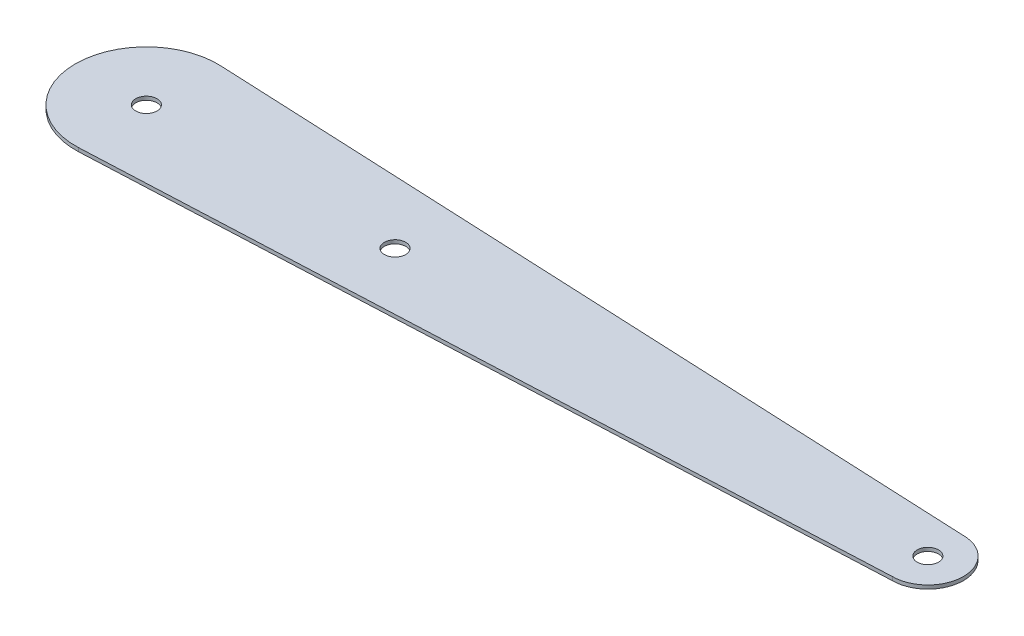
ISO-10303-21;
HEADER;
FILE_DESCRIPTION(('STEP AP214'),'2;1');
FILE_NAME('part.step','',(''),(''),'','','');
FILE_SCHEMA(('AUTOMOTIVE_DESIGN { 1 0 10303 214 1 1 1 1 }'));
ENDSEC;
DATA;
#1=APPLICATION_CONTEXT('core data for automotive mechanical design processes');
#2=APPLICATION_PROTOCOL_DEFINITION('international standard','automotive_design',2000,#1);
#3=PRODUCT_CONTEXT('',#1,'mechanical');
#4=PRODUCT('Part','Part','',(#3));
#5=PRODUCT_RELATED_PRODUCT_CATEGORY('part','',(#4));
#6=PRODUCT_DEFINITION_FORMATION('','',#4);
#7=PRODUCT_DEFINITION_CONTEXT('part definition',#1,'design');
#8=PRODUCT_DEFINITION('design','',#6,#7);
#9=PRODUCT_DEFINITION_SHAPE('','',#8);
#10=(LENGTH_UNIT() NAMED_UNIT(*) SI_UNIT(.MILLI.,.METRE.));
#11=(NAMED_UNIT(*) PLANE_ANGLE_UNIT() SI_UNIT($,.RADIAN.));
#12=(NAMED_UNIT(*) SI_UNIT($,.STERADIAN.) SOLID_ANGLE_UNIT());
#13=UNCERTAINTY_MEASURE_WITH_UNIT(LENGTH_MEASURE(1.E-05),#10,'distance_accuracy_value','');
#14=(GEOMETRIC_REPRESENTATION_CONTEXT(3) GLOBAL_UNCERTAINTY_ASSIGNED_CONTEXT((#13)) GLOBAL_UNIT_ASSIGNED_CONTEXT((#10,
#11,#12)) REPRESENTATION_CONTEXT('',''));
#15=CARTESIAN_POINT('',(0.,0.,0.));
#16=DIRECTION('',(0.,0.,1.));
#17=DIRECTION('',(1.,0.,0.));
#18=AXIS2_PLACEMENT_3D('',#15,#16,#17);
#19=CARTESIAN_POINT('',(300.,2.54,0.));
#20=DIRECTION('',(0.,-1.,0.));
#21=DIRECTION('',(0.,0.,-1.));
#22=AXIS2_PLACEMENT_3D('',#19,#20,#21);
#23=CYLINDRICAL_SURFACE('',#22,25.);
#24=CARTESIAN_POINT('',(300.,0.,0.));
#25=DIRECTION('',(0.,1.,0.));
#26=DIRECTION('',(0.,0.,1.));
#27=AXIS2_PLACEMENT_3D('',#24,#25,#26);
#28=CIRCLE('',#27,25.);
#29=CARTESIAN_POINT('',(300.,0.,25.));
#30=VERTEX_POINT('',#29);
#31=CARTESIAN_POINT('',(300.,0.,-25.));
#32=VERTEX_POINT('',#31);
#33=EDGE_CURVE('E116',#30,#32,#28,.T.);
#34=ORIENTED_EDGE('',*,*,#33,.T.);
#35=DIRECTION('',(0.,-1.,0.));
#36=VECTOR('',#35,1.);
#37=CARTESIAN_POINT('',(300.,2.54,-25.));
#38=LINE('',#37,#36);
#39=CARTESIAN_POINT('',(300.,2.54,-25.));
#40=VERTEX_POINT('',#39);
#41=EDGE_CURVE('E11',#40,#32,#38,.T.);
#42=ORIENTED_EDGE('',*,*,#41,.F.);
#43=CARTESIAN_POINT('',(300.,2.54,0.));
#44=DIRECTION('',(0.,1.,0.));
#45=DIRECTION('',(0.,0.,1.));
#46=AXIS2_PLACEMENT_3D('',#43,#44,#45);
#47=CIRCLE('',#46,25.);
#48=CARTESIAN_POINT('',(300.,2.54,25.));
#49=VERTEX_POINT('',#48);
#50=EDGE_CURVE('E99',#49,#40,#47,.T.);
#51=ORIENTED_EDGE('',*,*,#50,.F.);
#52=DIRECTION('',(0.,-1.,0.));
#53=VECTOR('',#52,1.);
#54=CARTESIAN_POINT('',(300.,2.54,25.));
#55=LINE('',#54,#53);
#56=EDGE_CURVE('E112',#49,#30,#55,.T.);
#57=ORIENTED_EDGE('',*,*,#56,.T.);
#58=EDGE_LOOP('',(#34,#42,#51,#57));
#59=FACE_BOUND('',#58,.T.);
#60=ADVANCED_FACE('F45',(#59),#23,.T.);
#61=CARTESIAN_POINT('',(-247.72491878345,2.54,-49.9482132358916));
#62=DIRECTION('',(-0.0455016243310075,0.,0.998964264717833));
#63=DIRECTION('',(0.998964264717833,0.,0.0455016243310075));
#64=AXIS2_PLACEMENT_3D('',#61,#62,#63);
#65=PLANE('',#64);
#66=DIRECTION('',(-0.998964264717833,0.,-0.0455016243310075));
#67=VECTOR('',#66,1.);
#68=CARTESIAN_POINT('',(-247.72491878345,0.,-49.9482132358916));
#69=LINE('',#68,#67);
#70=CARTESIAN_POINT('',(-247.72491878345,0.,-49.9482132358916));
#71=VERTEX_POINT('',#70);
#72=EDGE_CURVE('E104',#32,#71,#69,.T.);
#73=ORIENTED_EDGE('',*,*,#72,.T.);
#74=DIRECTION('',(0.,-1.,0.));
#75=VECTOR('',#74,1.);
#76=CARTESIAN_POINT('',(-247.72491878345,2.54,-49.9482132358916));
#77=LINE('',#76,#75);
#78=CARTESIAN_POINT('',(-247.72491878345,2.54,-49.9482132358916));
#79=VERTEX_POINT('',#78);
#80=EDGE_CURVE('E55',#79,#71,#77,.T.);
#81=ORIENTED_EDGE('',*,*,#80,.F.);
#82=DIRECTION('',(-0.998964264717833,0.,-0.0455016243310075));
#83=VECTOR('',#82,1.);
#84=CARTESIAN_POINT('',(-247.72491878345,2.54,-49.9482132358916));
#85=LINE('',#84,#83);
#86=EDGE_CURVE('E94',#40,#79,#85,.T.);
#87=ORIENTED_EDGE('',*,*,#86,.F.);
#88=ORIENTED_EDGE('',*,*,#41,.T.);
#89=EDGE_LOOP('',(#73,#81,#87,#88));
#90=FACE_BOUND('',#89,.T.);
#91=ADVANCED_FACE('F103',(#90),#65,.F.);
#92=CARTESIAN_POINT('',(-250.,2.54,0.));
#93=DIRECTION('',(0.,-1.,0.));
#94=DIRECTION('',(0.,0.,-1.));
#95=AXIS2_PLACEMENT_3D('',#92,#93,#94);
#96=CYLINDRICAL_SURFACE('',#95,49.9999999999999);
#97=CARTESIAN_POINT('',(-250.,0.,0.));
#98=DIRECTION('',(0.,1.,0.));
#99=DIRECTION('',(0.,0.,1.));
#100=AXIS2_PLACEMENT_3D('',#97,#98,#99);
#101=CIRCLE('',#100,49.9999999999999);
#102=CARTESIAN_POINT('',(-247.72491878345,0.,49.9482132358916));
#103=VERTEX_POINT('',#102);
#104=EDGE_CURVE('E81',#71,#103,#101,.T.);
#105=ORIENTED_EDGE('',*,*,#104,.T.);
#106=DIRECTION('',(0.,-1.,0.));
#107=VECTOR('',#106,1.);
#108=CARTESIAN_POINT('',(-247.72491878345,2.54,49.9482132358916));
#109=LINE('',#108,#107);
#110=CARTESIAN_POINT('',(-247.72491878345,2.54,49.9482132358916));
#111=VERTEX_POINT('',#110);
#112=EDGE_CURVE('E106',#111,#103,#109,.T.);
#113=ORIENTED_EDGE('',*,*,#112,.F.);
#114=CARTESIAN_POINT('',(-250.,2.54,0.));
#115=DIRECTION('',(0.,1.,0.));
#116=DIRECTION('',(0.,0.,1.));
#117=AXIS2_PLACEMENT_3D('',#114,#115,#116);
#118=CIRCLE('',#117,49.9999999999999);
#119=EDGE_CURVE('E97',#79,#111,#118,.T.);
#120=ORIENTED_EDGE('',*,*,#119,.F.);
#121=ORIENTED_EDGE('',*,*,#80,.T.);
#122=EDGE_LOOP('',(#105,#113,#120,#121));
#123=FACE_BOUND('',#122,.T.);
#124=ADVANCED_FACE('F108',(#123),#96,.T.);
#125=CARTESIAN_POINT('',(300.,2.54,25.));
#126=DIRECTION('',(-0.0455016243310075,0.,-0.998964264717833));
#127=DIRECTION('',(-0.998964264717833,0.,0.0455016243310075));
#128=AXIS2_PLACEMENT_3D('',#125,#126,#127);
#129=PLANE('',#128);
#130=DIRECTION('',(0.998964264717833,0.,-0.0455016243310075));
#131=VECTOR('',#130,1.);
#132=CARTESIAN_POINT('',(300.,0.,25.));
#133=LINE('',#132,#131);
#134=EDGE_CURVE('E87',#103,#30,#133,.T.);
#135=ORIENTED_EDGE('',*,*,#134,.T.);
#136=ORIENTED_EDGE('',*,*,#56,.F.);
#137=DIRECTION('',(0.998964264717833,0.,-0.0455016243310075));
#138=VECTOR('',#137,1.);
#139=CARTESIAN_POINT('',(300.,2.54,25.));
#140=LINE('',#139,#138);
#141=EDGE_CURVE('E64',#111,#49,#140,.T.);
#142=ORIENTED_EDGE('',*,*,#141,.F.);
#143=ORIENTED_EDGE('',*,*,#112,.T.);
#144=EDGE_LOOP('',(#135,#136,#142,#143));
#145=FACE_BOUND('',#144,.T.);
#146=ADVANCED_FACE('F172',(#145),#129,.F.);
#147=CARTESIAN_POINT('',(300.,2.54,0.));
#148=DIRECTION('',(0.,1.,0.));
#149=DIRECTION('',(0.,0.,1.));
#150=AXIS2_PLACEMENT_3D('',#147,#148,#149);
#151=PLANE('',#150);
#152=CARTESIAN_POINT('',(-250.,2.54,0.));
#153=DIRECTION('',(0.,1.,0.));
#154=DIRECTION('',(0.,0.,1.));
#155=AXIS2_PLACEMENT_3D('',#152,#153,#154);
#156=CIRCLE('',#155,7.50000000000001);
#157=CARTESIAN_POINT('',(-250.,2.54,7.50000000000001));
#158=VERTEX_POINT('',#157);
#159=EDGE_CURVE('E229',#158,#158,#156,.T.);
#160=ORIENTED_EDGE('',*,*,#159,.F.);
#161=EDGE_LOOP('',(#160));
#162=FACE_BOUND('',#161,.T.);
#163=CARTESIAN_POINT('',(300.,2.54,0.));
#164=DIRECTION('',(0.,1.,0.));
#165=DIRECTION('',(0.,0.,-1.));
#166=AXIS2_PLACEMENT_3D('',#163,#164,#165);
#167=CIRCLE('',#166,7.50000000000001);
#168=CARTESIAN_POINT('',(300.,2.54,-7.50000000000001));
#169=VERTEX_POINT('',#168);
#170=EDGE_CURVE('E233',#169,#169,#167,.T.);
#171=ORIENTED_EDGE('',*,*,#170,.F.);
#172=EDGE_LOOP('',(#171));
#173=FACE_BOUND('',#172,.T.);
#174=CARTESIAN_POINT('',(-75.,2.54,0.));
#175=DIRECTION('',(0.,1.,0.));
#176=DIRECTION('',(0.,0.,1.));
#177=AXIS2_PLACEMENT_3D('',#174,#175,#176);
#178=CIRCLE('',#177,7.50000000000001);
#179=CARTESIAN_POINT('',(-75.,2.54,7.50000000000001));
#180=VERTEX_POINT('',#179);
#181=EDGE_CURVE('E134',#180,#180,#178,.T.);
#182=ORIENTED_EDGE('',*,*,#181,.F.);
#183=EDGE_LOOP('',(#182));
#184=FACE_BOUND('',#183,.T.);
#185=ORIENTED_EDGE('',*,*,#50,.T.);
#186=ORIENTED_EDGE('',*,*,#86,.T.);
#187=ORIENTED_EDGE('',*,*,#119,.T.);
#188=ORIENTED_EDGE('',*,*,#141,.T.);
#189=EDGE_LOOP('',(#185,#186,#187,#188));
#190=FACE_BOUND('',#189,.T.);
#191=ADVANCED_FACE('F95',(#162,#173,#184,#190),#151,.T.);
#192=CARTESIAN_POINT('',(300.,0.,0.));
#193=DIRECTION('',(0.,1.,0.));
#194=DIRECTION('',(0.,0.,1.));
#195=AXIS2_PLACEMENT_3D('',#192,#193,#194);
#196=PLANE('',#195);
#197=CARTESIAN_POINT('',(-250.,0.,0.));
#198=DIRECTION('',(0.,1.,0.));
#199=DIRECTION('',(0.,0.,1.));
#200=AXIS2_PLACEMENT_3D('',#197,#198,#199);
#201=CIRCLE('',#200,7.50000000000001);
#202=CARTESIAN_POINT('',(-250.,0.,7.50000000000001));
#203=VERTEX_POINT('',#202);
#204=EDGE_CURVE('E48',#203,#203,#201,.T.);
#205=ORIENTED_EDGE('',*,*,#204,.T.);
#206=EDGE_LOOP('',(#205));
#207=FACE_BOUND('',#206,.T.);
#208=CARTESIAN_POINT('',(300.,0.,0.));
#209=DIRECTION('',(0.,1.,0.));
#210=DIRECTION('',(0.,0.,1.));
#211=AXIS2_PLACEMENT_3D('',#208,#209,#210);
#212=CIRCLE('',#211,7.50000000000001);
#213=CARTESIAN_POINT('',(300.,0.,7.50000000000001));
#214=VERTEX_POINT('',#213);
#215=EDGE_CURVE('E133',#214,#214,#212,.T.);
#216=ORIENTED_EDGE('',*,*,#215,.T.);
#217=EDGE_LOOP('',(#216));
#218=FACE_BOUND('',#217,.T.);
#219=CARTESIAN_POINT('',(-75.,0.,0.));
#220=DIRECTION('',(0.,1.,0.));
#221=DIRECTION('',(0.,0.,1.));
#222=AXIS2_PLACEMENT_3D('',#219,#220,#221);
#223=CIRCLE('',#222,7.50000000000001);
#224=CARTESIAN_POINT('',(-75.,0.,7.50000000000001));
#225=VERTEX_POINT('',#224);
#226=EDGE_CURVE('E130',#225,#225,#223,.T.);
#227=ORIENTED_EDGE('',*,*,#226,.T.);
#228=EDGE_LOOP('',(#227));
#229=FACE_BOUND('',#228,.T.);
#230=ORIENTED_EDGE('',*,*,#33,.F.);
#231=ORIENTED_EDGE('',*,*,#134,.F.);
#232=ORIENTED_EDGE('',*,*,#104,.F.);
#233=ORIENTED_EDGE('',*,*,#72,.F.);
#234=EDGE_LOOP('',(#230,#231,#232,#233));
#235=FACE_BOUND('',#234,.T.);
#236=ADVANCED_FACE('F143',(#207,#218,#229,#235),#196,.F.);
#237=CARTESIAN_POINT('',(-75.,-7.46,0.));
#238=DIRECTION('',(0.,1.,0.));
#239=DIRECTION('',(0.,0.,1.));
#240=AXIS2_PLACEMENT_3D('',#237,#238,#239);
#241=CYLINDRICAL_SURFACE('',#240,7.50000000000001);
#242=ORIENTED_EDGE('',*,*,#181,.T.);
#243=EDGE_LOOP('',(#242));
#244=FACE_BOUND('',#243,.T.);
#245=ORIENTED_EDGE('',*,*,#226,.F.);
#246=EDGE_LOOP('',(#245));
#247=FACE_BOUND('',#246,.T.);
#248=ADVANCED_FACE('F153',(#244,#247),#241,.F.);
#249=CARTESIAN_POINT('',(300.,-7.46,0.));
#250=DIRECTION('',(0.,1.,0.));
#251=DIRECTION('',(0.,0.,1.));
#252=AXIS2_PLACEMENT_3D('',#249,#250,#251);
#253=CYLINDRICAL_SURFACE('',#252,7.50000000000001);
#254=ORIENTED_EDGE('',*,*,#170,.T.);
#255=EDGE_LOOP('',(#254));
#256=FACE_BOUND('',#255,.T.);
#257=ORIENTED_EDGE('',*,*,#215,.F.);
#258=EDGE_LOOP('',(#257));
#259=FACE_BOUND('',#258,.T.);
#260=ADVANCED_FACE('F147',(#256,#259),#253,.F.);
#261=CARTESIAN_POINT('',(-250.,-7.46,0.));
#262=DIRECTION('',(0.,1.,0.));
#263=DIRECTION('',(0.,0.,1.));
#264=AXIS2_PLACEMENT_3D('',#261,#262,#263);
#265=CYLINDRICAL_SURFACE('',#264,7.50000000000001);
#266=ORIENTED_EDGE('',*,*,#159,.T.);
#267=EDGE_LOOP('',(#266));
#268=FACE_BOUND('',#267,.T.);
#269=ORIENTED_EDGE('',*,*,#204,.F.);
#270=EDGE_LOOP('',(#269));
#271=FACE_BOUND('',#270,.T.);
#272=ADVANCED_FACE('F145',(#268,#271),#265,.F.);
#273=CLOSED_SHELL('',(#60,#91,#124,#146,#191,#236,#248,#260,#272));
#274=MANIFOLD_SOLID_BREP('B2',#273);
#275=ADVANCED_BREP_SHAPE_REPRESENTATION('',(#18,#274),#14);
#276=SHAPE_DEFINITION_REPRESENTATION(#9,#275);
ENDSEC;
END-ISO-10303-21;
